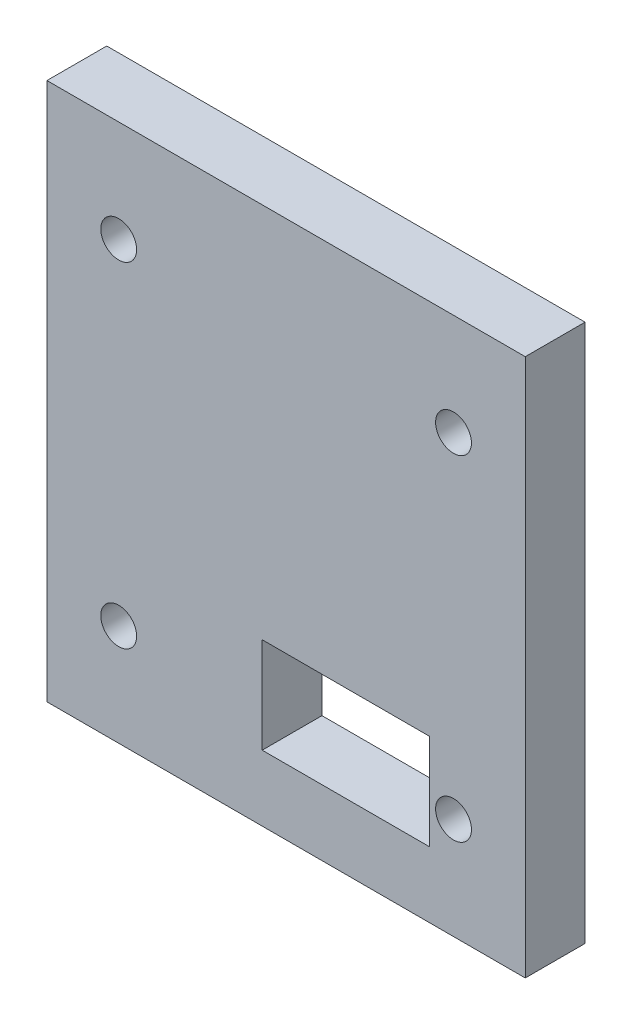
ISO-10303-21;
HEADER;
FILE_DESCRIPTION(('STEP AP214'),'2;1');
FILE_NAME('part.step','',(''),(''),'','','');
FILE_SCHEMA(('AUTOMOTIVE_DESIGN { 1 0 10303 214 1 1 1 1 }'));
ENDSEC;
DATA;
#1=APPLICATION_CONTEXT('core data for automotive mechanical design processes');
#2=APPLICATION_PROTOCOL_DEFINITION('international standard','automotive_design',2000,#1);
#3=PRODUCT_CONTEXT('',#1,'mechanical');
#4=PRODUCT('Part','Part','',(#3));
#5=PRODUCT_RELATED_PRODUCT_CATEGORY('part','',(#4));
#6=PRODUCT_DEFINITION_FORMATION('','',#4);
#7=PRODUCT_DEFINITION_CONTEXT('part definition',#1,'design');
#8=PRODUCT_DEFINITION('design','',#6,#7);
#9=PRODUCT_DEFINITION_SHAPE('','',#8);
#10=(LENGTH_UNIT() NAMED_UNIT(*) SI_UNIT(.MILLI.,.METRE.));
#11=(NAMED_UNIT(*) PLANE_ANGLE_UNIT() SI_UNIT($,.RADIAN.));
#12=(NAMED_UNIT(*) SI_UNIT($,.STERADIAN.) SOLID_ANGLE_UNIT());
#13=UNCERTAINTY_MEASURE_WITH_UNIT(LENGTH_MEASURE(1.E-05),#10,'distance_accuracy_value','');
#14=(GEOMETRIC_REPRESENTATION_CONTEXT(3) GLOBAL_UNCERTAINTY_ASSIGNED_CONTEXT((#13)) GLOBAL_UNIT_ASSIGNED_CONTEXT((#10,
#11,#12)) REPRESENTATION_CONTEXT('',''));
#15=CARTESIAN_POINT('',(0.,0.,0.));
#16=DIRECTION('',(0.,0.,1.));
#17=DIRECTION('',(1.,0.,0.));
#18=AXIS2_PLACEMENT_3D('',#15,#16,#17);
#19=CARTESIAN_POINT('',(0.,0.,5.));
#20=DIRECTION('',(0.,1.,0.));
#21=DIRECTION('',(0.,0.,1.));
#22=AXIS2_PLACEMENT_3D('',#19,#20,#21);
#23=PLANE('',#22);
#24=CARTESIAN_POINT('',(2.,0.,2.5));
#25=DIRECTION('',(0.,-1.,0.));
#26=DIRECTION('',(0.,0.,-1.));
#27=AXIS2_PLACEMENT_3D('',#24,#25,#26);
#28=CIRCLE('',#27,1.5);
#29=CARTESIAN_POINT('',(2.,0.,1.));
#30=VERTEX_POINT('',#29);
#31=EDGE_CURVE('E188',#30,#30,#28,.T.);
#32=ORIENTED_EDGE('',*,*,#31,.F.);
#33=EDGE_LOOP('',(#32));
#34=FACE_BOUND('',#33,.T.);
#35=CARTESIAN_POINT('',(25.25,0.,2.5));
#36=DIRECTION('',(0.,-1.,0.));
#37=DIRECTION('',(0.,0.,-1.));
#38=AXIS2_PLACEMENT_3D('',#35,#36,#37);
#39=CIRCLE('',#38,1.5);
#40=CARTESIAN_POINT('',(25.25,0.,0.999999999999999));
#41=VERTEX_POINT('',#40);
#42=EDGE_CURVE('E183',#41,#41,#39,.T.);
#43=ORIENTED_EDGE('',*,*,#42,.F.);
#44=EDGE_LOOP('',(#43));
#45=FACE_BOUND('',#44,.T.);
#46=CARTESIAN_POINT('',(9.75,0.,2.5));
#47=DIRECTION('',(0.,-1.,0.));
#48=DIRECTION('',(0.,0.,-1.));
#49=AXIS2_PLACEMENT_3D('',#46,#47,#48);
#50=CIRCLE('',#49,1.5);
#51=CARTESIAN_POINT('',(9.75,0.,0.999999999999998));
#52=VERTEX_POINT('',#51);
#53=EDGE_CURVE('E195',#52,#52,#50,.T.);
#54=ORIENTED_EDGE('',*,*,#53,.F.);
#55=EDGE_LOOP('',(#54));
#56=FACE_BOUND('',#55,.T.);
#57=CARTESIAN_POINT('',(33.,0.,2.5));
#58=DIRECTION('',(0.,-1.,0.));
#59=DIRECTION('',(0.,0.,-1.));
#60=AXIS2_PLACEMENT_3D('',#57,#58,#59);
#61=CIRCLE('',#60,1.5);
#62=CARTESIAN_POINT('',(33.,0.,0.999999999999996));
#63=VERTEX_POINT('',#62);
#64=EDGE_CURVE('E200',#63,#63,#61,.T.);
#65=ORIENTED_EDGE('',*,*,#64,.F.);
#66=EDGE_LOOP('',(#65));
#67=FACE_BOUND('',#66,.T.);
#68=DIRECTION('',(1.,0.,0.));
#69=VECTOR('',#68,1.);
#70=CARTESIAN_POINT('',(0.,0.,0.));
#71=LINE('',#70,#69);
#72=CARTESIAN_POINT('',(-2.5,0.,0.));
#73=VERTEX_POINT('',#72);
#74=CARTESIAN_POINT('',(37.5,0.,0.));
#75=VERTEX_POINT('',#74);
#76=EDGE_CURVE('E187',#73,#75,#71,.T.);
#77=ORIENTED_EDGE('',*,*,#76,.T.);
#78=DIRECTION('',(0.,0.,-1.));
#79=VECTOR('',#78,1.);
#80=CARTESIAN_POINT('',(37.5,0.,5.));
#81=LINE('',#80,#79);
#82=CARTESIAN_POINT('',(37.5,0.,5.));
#83=VERTEX_POINT('',#82);
#84=EDGE_CURVE('E174',#83,#75,#81,.T.);
#85=ORIENTED_EDGE('',*,*,#84,.F.);
#86=DIRECTION('',(1.,0.,0.));
#87=VECTOR('',#86,1.);
#88=CARTESIAN_POINT('',(0.,0.,5.));
#89=LINE('',#88,#87);
#90=CARTESIAN_POINT('',(-2.5,0.,5.));
#91=VERTEX_POINT('',#90);
#92=EDGE_CURVE('E41',#91,#83,#89,.T.);
#93=ORIENTED_EDGE('',*,*,#92,.F.);
#94=DIRECTION('',(0.,0.,1.));
#95=VECTOR('',#94,1.);
#96=CARTESIAN_POINT('',(-2.5,0.,0.));
#97=LINE('',#96,#95);
#98=EDGE_CURVE('E162',#73,#91,#97,.T.);
#99=ORIENTED_EDGE('',*,*,#98,.F.);
#100=EDGE_LOOP('',(#77,#85,#93,#99));
#101=FACE_BOUND('',#100,.T.);
#102=ADVANCED_FACE('F33',(#34,#45,#56,#67,#101),#23,.F.);
#103=CARTESIAN_POINT('',(0.,45.,5.));
#104=DIRECTION('',(0.,-1.,0.));
#105=DIRECTION('',(0.,0.,-1.));
#106=AXIS2_PLACEMENT_3D('',#103,#104,#105);
#107=PLANE('',#106);
#108=DIRECTION('',(-1.,0.,0.));
#109=VECTOR('',#108,1.);
#110=CARTESIAN_POINT('',(0.,45.,0.));
#111=LINE('',#110,#109);
#112=CARTESIAN_POINT('',(37.5,45.,0.));
#113=VERTEX_POINT('',#112);
#114=CARTESIAN_POINT('',(-2.5,45.,0.));
#115=VERTEX_POINT('',#114);
#116=EDGE_CURVE('E36',#113,#115,#111,.T.);
#117=ORIENTED_EDGE('',*,*,#116,.T.);
#118=DIRECTION('',(0.,0.,-1.));
#119=VECTOR('',#118,1.);
#120=CARTESIAN_POINT('',(-2.5,45.,0.));
#121=LINE('',#120,#119);
#122=CARTESIAN_POINT('',(-2.5,45.,4.99999999999999));
#123=VERTEX_POINT('',#122);
#124=EDGE_CURVE('E168',#123,#115,#121,.T.);
#125=ORIENTED_EDGE('',*,*,#124,.F.);
#126=DIRECTION('',(-1.,0.,0.));
#127=VECTOR('',#126,1.);
#128=CARTESIAN_POINT('',(0.,45.,5.));
#129=LINE('',#128,#127);
#130=CARTESIAN_POINT('',(37.5,45.,5.));
#131=VERTEX_POINT('',#130);
#132=EDGE_CURVE('E11',#131,#123,#129,.T.);
#133=ORIENTED_EDGE('',*,*,#132,.F.);
#134=DIRECTION('',(0.,0.,1.));
#135=VECTOR('',#134,1.);
#136=CARTESIAN_POINT('',(37.5,45.,5.));
#137=LINE('',#136,#135);
#138=EDGE_CURVE('E180',#113,#131,#137,.T.);
#139=ORIENTED_EDGE('',*,*,#138,.F.);
#140=EDGE_LOOP('',(#117,#125,#133,#139));
#141=FACE_BOUND('',#140,.T.);
#142=ADVANCED_FACE('F214',(#141),#107,.F.);
#143=CARTESIAN_POINT('',(0.,0.,5.));
#144=DIRECTION('',(0.,0.,-1.));
#145=DIRECTION('',(-1.,0.,0.));
#146=AXIS2_PLACEMENT_3D('',#143,#144,#145);
#147=PLANE('',#146);
#148=DIRECTION('',(0.,1.,0.));
#149=VECTOR('',#148,1.);
#150=CARTESIAN_POINT('',(29.5,13.5,5.));
#151=LINE('',#150,#149);
#152=CARTESIAN_POINT('',(29.5,5.5,5.));
#153=VERTEX_POINT('',#152);
#154=CARTESIAN_POINT('',(29.5,13.5,5.));
#155=VERTEX_POINT('',#154);
#156=EDGE_CURVE('E122',#153,#155,#151,.T.);
#157=ORIENTED_EDGE('',*,*,#156,.F.);
#158=DIRECTION('',(1.,0.,0.));
#159=VECTOR('',#158,1.);
#160=CARTESIAN_POINT('',(15.5,5.5,5.));
#161=LINE('',#160,#159);
#162=CARTESIAN_POINT('',(15.5,5.5,5.));
#163=VERTEX_POINT('',#162);
#164=EDGE_CURVE('E115',#163,#153,#161,.T.);
#165=ORIENTED_EDGE('',*,*,#164,.F.);
#166=DIRECTION('',(0.,-1.,0.));
#167=VECTOR('',#166,1.);
#168=CARTESIAN_POINT('',(15.5,13.5,5.));
#169=LINE('',#168,#167);
#170=CARTESIAN_POINT('',(15.5,13.5,5.));
#171=VERTEX_POINT('',#170);
#172=EDGE_CURVE('E126',#171,#163,#169,.T.);
#173=ORIENTED_EDGE('',*,*,#172,.F.);
#174=DIRECTION('',(-1.,0.,0.));
#175=VECTOR('',#174,1.);
#176=CARTESIAN_POINT('',(15.5,13.5,5.));
#177=LINE('',#176,#175);
#178=EDGE_CURVE('E49',#155,#171,#177,.T.);
#179=ORIENTED_EDGE('',*,*,#178,.F.);
#180=EDGE_LOOP('',(#157,#165,#173,#179));
#181=FACE_BOUND('',#180,.T.);
#182=CARTESIAN_POINT('',(3.5,8.5,5.));
#183=DIRECTION('',(0.,0.,1.));
#184=DIRECTION('',(1.,0.,0.));
#185=AXIS2_PLACEMENT_3D('',#182,#183,#184);
#186=CIRCLE('',#185,1.5);
#187=CARTESIAN_POINT('',(5.,8.5,5.));
#188=VERTEX_POINT('',#187);
#189=EDGE_CURVE('E135',#188,#188,#186,.T.);
#190=ORIENTED_EDGE('',*,*,#189,.F.);
#191=EDGE_LOOP('',(#190));
#192=FACE_BOUND('',#191,.T.);
#193=CARTESIAN_POINT('',(31.5,36.5,5.));
#194=DIRECTION('',(0.,0.,1.));
#195=DIRECTION('',(1.,0.,0.));
#196=AXIS2_PLACEMENT_3D('',#193,#194,#195);
#197=CIRCLE('',#196,1.50000000000001);
#198=CARTESIAN_POINT('',(33.,36.5,5.));
#199=VERTEX_POINT('',#198);
#200=EDGE_CURVE('E144',#199,#199,#197,.T.);
#201=ORIENTED_EDGE('',*,*,#200,.F.);
#202=EDGE_LOOP('',(#201));
#203=FACE_BOUND('',#202,.T.);
#204=CARTESIAN_POINT('',(31.5,8.5,5.));
#205=DIRECTION('',(0.,0.,1.));
#206=DIRECTION('',(1.,0.,0.));
#207=AXIS2_PLACEMENT_3D('',#204,#205,#206);
#208=CIRCLE('',#207,1.50000000000001);
#209=CARTESIAN_POINT('',(33.,8.5,5.));
#210=VERTEX_POINT('',#209);
#211=EDGE_CURVE('E136',#210,#210,#208,.T.);
#212=ORIENTED_EDGE('',*,*,#211,.F.);
#213=EDGE_LOOP('',(#212));
#214=FACE_BOUND('',#213,.T.);
#215=CARTESIAN_POINT('',(3.5,36.5,5.));
#216=DIRECTION('',(0.,0.,1.));
#217=DIRECTION('',(1.,0.,0.));
#218=AXIS2_PLACEMENT_3D('',#215,#216,#217);
#219=CIRCLE('',#218,1.5);
#220=CARTESIAN_POINT('',(5.,36.5,5.));
#221=VERTEX_POINT('',#220);
#222=EDGE_CURVE('E143',#221,#221,#219,.T.);
#223=ORIENTED_EDGE('',*,*,#222,.F.);
#224=EDGE_LOOP('',(#223));
#225=FACE_BOUND('',#224,.T.);
#226=ORIENTED_EDGE('',*,*,#132,.T.);
#227=DIRECTION('',(0.,1.,0.));
#228=VECTOR('',#227,1.);
#229=CARTESIAN_POINT('',(-2.5,45.,4.99999999999999));
#230=LINE('',#229,#228);
#231=EDGE_CURVE('E165',#91,#123,#230,.T.);
#232=ORIENTED_EDGE('',*,*,#231,.F.);
#233=ORIENTED_EDGE('',*,*,#92,.T.);
#234=DIRECTION('',(0.,-1.,0.));
#235=VECTOR('',#234,1.);
#236=CARTESIAN_POINT('',(37.5,45.,5.));
#237=LINE('',#236,#235);
#238=EDGE_CURVE('E171',#131,#83,#237,.T.);
#239=ORIENTED_EDGE('',*,*,#238,.F.);
#240=EDGE_LOOP('',(#226,#232,#233,#239));
#241=FACE_BOUND('',#240,.T.);
#242=ADVANCED_FACE('F222',(#181,#192,#203,#214,#225,#241),#147,.F.);
#243=CARTESIAN_POINT('',(0.,0.,0.));
#244=DIRECTION('',(0.,0.,-1.));
#245=DIRECTION('',(-1.,0.,0.));
#246=AXIS2_PLACEMENT_3D('',#243,#244,#245);
#247=PLANE('',#246);
#248=DIRECTION('',(1.,0.,0.));
#249=VECTOR('',#248,1.);
#250=CARTESIAN_POINT('',(15.5,5.5,0.));
#251=LINE('',#250,#249);
#252=CARTESIAN_POINT('',(15.5,5.5,0.));
#253=VERTEX_POINT('',#252);
#254=CARTESIAN_POINT('',(29.5,5.5,0.));
#255=VERTEX_POINT('',#254);
#256=EDGE_CURVE('E112',#253,#255,#251,.T.);
#257=ORIENTED_EDGE('',*,*,#256,.T.);
#258=DIRECTION('',(0.,1.,0.));
#259=VECTOR('',#258,1.);
#260=CARTESIAN_POINT('',(29.5,13.5,0.));
#261=LINE('',#260,#259);
#262=CARTESIAN_POINT('',(29.5,13.5,0.));
#263=VERTEX_POINT('',#262);
#264=EDGE_CURVE('E99',#255,#263,#261,.T.);
#265=ORIENTED_EDGE('',*,*,#264,.T.);
#266=DIRECTION('',(-1.,0.,0.));
#267=VECTOR('',#266,1.);
#268=CARTESIAN_POINT('',(15.5,13.5,0.));
#269=LINE('',#268,#267);
#270=CARTESIAN_POINT('',(15.5,13.5,0.));
#271=VERTEX_POINT('',#270);
#272=EDGE_CURVE('E130',#263,#271,#269,.T.);
#273=ORIENTED_EDGE('',*,*,#272,.T.);
#274=DIRECTION('',(0.,-1.,0.));
#275=VECTOR('',#274,1.);
#276=CARTESIAN_POINT('',(15.5,13.5,0.));
#277=LINE('',#276,#275);
#278=EDGE_CURVE('E120',#271,#253,#277,.T.);
#279=ORIENTED_EDGE('',*,*,#278,.T.);
#280=EDGE_LOOP('',(#257,#265,#273,#279));
#281=FACE_BOUND('',#280,.T.);
#282=CARTESIAN_POINT('',(3.5,8.5,0.));
#283=DIRECTION('',(0.,0.,-1.));
#284=DIRECTION('',(-1.,0.,0.));
#285=AXIS2_PLACEMENT_3D('',#282,#283,#284);
#286=CIRCLE('',#285,1.5);
#287=CARTESIAN_POINT('',(2.,8.5,0.));
#288=VERTEX_POINT('',#287);
#289=EDGE_CURVE('E147',#288,#288,#286,.F.);
#290=ORIENTED_EDGE('',*,*,#289,.T.);
#291=EDGE_LOOP('',(#290));
#292=FACE_BOUND('',#291,.T.);
#293=CARTESIAN_POINT('',(31.5,36.5,0.));
#294=DIRECTION('',(0.,0.,-1.));
#295=DIRECTION('',(-1.,0.,0.));
#296=AXIS2_PLACEMENT_3D('',#293,#294,#295);
#297=CIRCLE('',#296,1.50000000000001);
#298=CARTESIAN_POINT('',(30.,36.5,0.));
#299=VERTEX_POINT('',#298);
#300=EDGE_CURVE('E140',#299,#299,#297,.F.);
#301=ORIENTED_EDGE('',*,*,#300,.T.);
#302=EDGE_LOOP('',(#301));
#303=FACE_BOUND('',#302,.T.);
#304=CARTESIAN_POINT('',(31.5,8.5,0.));
#305=DIRECTION('',(0.,0.,-1.));
#306=DIRECTION('',(-1.,0.,0.));
#307=AXIS2_PLACEMENT_3D('',#304,#305,#306);
#308=CIRCLE('',#307,1.50000000000001);
#309=CARTESIAN_POINT('',(30.,8.5,0.));
#310=VERTEX_POINT('',#309);
#311=EDGE_CURVE('E139',#310,#310,#308,.F.);
#312=ORIENTED_EDGE('',*,*,#311,.T.);
#313=EDGE_LOOP('',(#312));
#314=FACE_BOUND('',#313,.T.);
#315=CARTESIAN_POINT('',(3.5,36.5,0.));
#316=DIRECTION('',(0.,0.,-1.));
#317=DIRECTION('',(-1.,0.,0.));
#318=AXIS2_PLACEMENT_3D('',#315,#316,#317);
#319=CIRCLE('',#318,1.5);
#320=CARTESIAN_POINT('',(2.,36.5,0.));
#321=VERTEX_POINT('',#320);
#322=EDGE_CURVE('E156',#321,#321,#319,.F.);
#323=ORIENTED_EDGE('',*,*,#322,.T.);
#324=EDGE_LOOP('',(#323));
#325=FACE_BOUND('',#324,.T.);
#326=ORIENTED_EDGE('',*,*,#76,.F.);
#327=DIRECTION('',(0.,-1.,0.));
#328=VECTOR('',#327,1.);
#329=CARTESIAN_POINT('',(-2.5,45.,0.));
#330=LINE('',#329,#328);
#331=EDGE_CURVE('E159',#115,#73,#330,.T.);
#332=ORIENTED_EDGE('',*,*,#331,.F.);
#333=ORIENTED_EDGE('',*,*,#116,.F.);
#334=DIRECTION('',(0.,1.,0.));
#335=VECTOR('',#334,1.);
#336=CARTESIAN_POINT('',(37.5,45.,0.));
#337=LINE('',#336,#335);
#338=EDGE_CURVE('E177',#75,#113,#337,.T.);
#339=ORIENTED_EDGE('',*,*,#338,.F.);
#340=EDGE_LOOP('',(#326,#332,#333,#339));
#341=FACE_BOUND('',#340,.T.);
#342=ADVANCED_FACE('F118',(#281,#292,#303,#314,#325,#341),#247,.T.);
#343=CARTESIAN_POINT('',(33.,5.,2.5));
#344=DIRECTION('',(0.,-1.,0.));
#345=DIRECTION('',(0.,0.,-1.));
#346=AXIS2_PLACEMENT_3D('',#343,#344,#345);
#347=CYLINDRICAL_SURFACE('',#346,1.5);
#348=CARTESIAN_POINT('',(33.,5.,2.5));
#349=DIRECTION('',(0.,-1.,0.));
#350=DIRECTION('',(0.,0.,-1.));
#351=AXIS2_PLACEMENT_3D('',#348,#349,#350);
#352=CIRCLE('',#351,1.5);
#353=CARTESIAN_POINT('',(33.,5.,0.999999999999996));
#354=VERTEX_POINT('',#353);
#355=EDGE_CURVE('E191',#354,#354,#352,.T.);
#356=ORIENTED_EDGE('',*,*,#355,.F.);
#357=EDGE_LOOP('',(#356));
#358=FACE_BOUND('',#357,.T.);
#359=ORIENTED_EDGE('',*,*,#64,.T.);
#360=EDGE_LOOP('',(#359));
#361=FACE_BOUND('',#360,.T.);
#362=ADVANCED_FACE('F251',(#358,#361),#347,.F.);
#363=CARTESIAN_POINT('',(33.,5.,2.5));
#364=DIRECTION('',(0.,-1.,0.));
#365=DIRECTION('',(0.,0.,-1.));
#366=AXIS2_PLACEMENT_3D('',#363,#364,#365);
#367=PLANE('',#366);
#368=ORIENTED_EDGE('',*,*,#355,.T.);
#369=EDGE_LOOP('',(#368));
#370=FACE_BOUND('',#369,.T.);
#371=ADVANCED_FACE('F253',(#370),#367,.T.);
#372=CARTESIAN_POINT('',(9.75,5.,2.5));
#373=DIRECTION('',(0.,-1.,0.));
#374=DIRECTION('',(0.,0.,-1.));
#375=AXIS2_PLACEMENT_3D('',#372,#373,#374);
#376=CYLINDRICAL_SURFACE('',#375,1.5);
#377=CARTESIAN_POINT('',(9.75,5.,2.5));
#378=DIRECTION('',(0.,-1.,0.));
#379=DIRECTION('',(0.,0.,-1.));
#380=AXIS2_PLACEMENT_3D('',#377,#378,#379);
#381=CIRCLE('',#380,1.5);
#382=CARTESIAN_POINT('',(9.75,5.,0.999999999999998));
#383=VERTEX_POINT('',#382);
#384=EDGE_CURVE('E203',#383,#383,#381,.T.);
#385=ORIENTED_EDGE('',*,*,#384,.F.);
#386=EDGE_LOOP('',(#385));
#387=FACE_BOUND('',#386,.T.);
#388=ORIENTED_EDGE('',*,*,#53,.T.);
#389=EDGE_LOOP('',(#388));
#390=FACE_BOUND('',#389,.T.);
#391=ADVANCED_FACE('F260',(#387,#390),#376,.F.);
#392=CARTESIAN_POINT('',(9.75,5.,2.5));
#393=DIRECTION('',(0.,-1.,0.));
#394=DIRECTION('',(0.,0.,-1.));
#395=AXIS2_PLACEMENT_3D('',#392,#393,#394);
#396=PLANE('',#395);
#397=ORIENTED_EDGE('',*,*,#384,.T.);
#398=EDGE_LOOP('',(#397));
#399=FACE_BOUND('',#398,.T.);
#400=ADVANCED_FACE('F268',(#399),#396,.T.);
#401=CARTESIAN_POINT('',(25.25,5.,2.5));
#402=DIRECTION('',(0.,-1.,0.));
#403=DIRECTION('',(0.,0.,-1.));
#404=AXIS2_PLACEMENT_3D('',#401,#402,#403);
#405=CYLINDRICAL_SURFACE('',#404,1.5);
#406=CARTESIAN_POINT('',(25.25,5.,2.5));
#407=DIRECTION('',(0.,-1.,0.));
#408=DIRECTION('',(0.,0.,-1.));
#409=AXIS2_PLACEMENT_3D('',#406,#407,#408);
#410=CIRCLE('',#409,1.5);
#411=CARTESIAN_POINT('',(25.25,5.,0.999999999999999));
#412=VERTEX_POINT('',#411);
#413=EDGE_CURVE('E192',#412,#412,#410,.T.);
#414=ORIENTED_EDGE('',*,*,#413,.F.);
#415=EDGE_LOOP('',(#414));
#416=FACE_BOUND('',#415,.T.);
#417=ORIENTED_EDGE('',*,*,#42,.T.);
#418=EDGE_LOOP('',(#417));
#419=FACE_BOUND('',#418,.T.);
#420=ADVANCED_FACE('F271',(#416,#419),#405,.F.);
#421=CARTESIAN_POINT('',(25.25,5.,2.5));
#422=DIRECTION('',(0.,-1.,0.));
#423=DIRECTION('',(0.,0.,-1.));
#424=AXIS2_PLACEMENT_3D('',#421,#422,#423);
#425=PLANE('',#424);
#426=ORIENTED_EDGE('',*,*,#413,.T.);
#427=EDGE_LOOP('',(#426));
#428=FACE_BOUND('',#427,.T.);
#429=ADVANCED_FACE('F390',(#428),#425,.T.);
#430=CARTESIAN_POINT('',(2.,5.,2.5));
#431=DIRECTION('',(0.,-1.,0.));
#432=DIRECTION('',(0.,0.,-1.));
#433=AXIS2_PLACEMENT_3D('',#430,#431,#432);
#434=CYLINDRICAL_SURFACE('',#433,1.5);
#435=CARTESIAN_POINT('',(2.,5.,2.5));
#436=DIRECTION('',(0.,-1.,0.));
#437=DIRECTION('',(0.,0.,-1.));
#438=AXIS2_PLACEMENT_3D('',#435,#436,#437);
#439=CIRCLE('',#438,1.5);
#440=CARTESIAN_POINT('',(2.,5.,1.));
#441=VERTEX_POINT('',#440);
#442=EDGE_CURVE('E184',#441,#441,#439,.T.);
#443=ORIENTED_EDGE('',*,*,#442,.F.);
#444=EDGE_LOOP('',(#443));
#445=FACE_BOUND('',#444,.T.);
#446=ORIENTED_EDGE('',*,*,#31,.T.);
#447=EDGE_LOOP('',(#446));
#448=FACE_BOUND('',#447,.T.);
#449=ADVANCED_FACE('F235',(#445,#448),#434,.F.);
#450=CARTESIAN_POINT('',(2.,5.,2.5));
#451=DIRECTION('',(0.,-1.,0.));
#452=DIRECTION('',(0.,0.,-1.));
#453=AXIS2_PLACEMENT_3D('',#450,#451,#452);
#454=PLANE('',#453);
#455=ORIENTED_EDGE('',*,*,#442,.T.);
#456=EDGE_LOOP('',(#455));
#457=FACE_BOUND('',#456,.T.);
#458=ADVANCED_FACE('F227',(#457),#454,.T.);
#459=CARTESIAN_POINT('',(37.5,0.,0.));
#460=DIRECTION('',(1.,0.,0.));
#461=DIRECTION('',(0.,0.,-1.));
#462=AXIS2_PLACEMENT_3D('',#459,#460,#461);
#463=PLANE('',#462);
#464=ORIENTED_EDGE('',*,*,#238,.T.);
#465=ORIENTED_EDGE('',*,*,#84,.T.);
#466=ORIENTED_EDGE('',*,*,#338,.T.);
#467=ORIENTED_EDGE('',*,*,#138,.T.);
#468=EDGE_LOOP('',(#464,#465,#466,#467));
#469=FACE_BOUND('',#468,.T.);
#470=ADVANCED_FACE('F225',(#469),#463,.T.);
#471=CARTESIAN_POINT('',(-2.5,0.,0.));
#472=DIRECTION('',(-1.,0.,0.));
#473=DIRECTION('',(0.,0.,1.));
#474=AXIS2_PLACEMENT_3D('',#471,#472,#473);
#475=PLANE('',#474);
#476=ORIENTED_EDGE('',*,*,#331,.T.);
#477=ORIENTED_EDGE('',*,*,#98,.T.);
#478=ORIENTED_EDGE('',*,*,#231,.T.);
#479=ORIENTED_EDGE('',*,*,#124,.T.);
#480=EDGE_LOOP('',(#476,#477,#478,#479));
#481=FACE_BOUND('',#480,.T.);
#482=ADVANCED_FACE('F219',(#481),#475,.T.);
#483=CARTESIAN_POINT('',(3.5,36.5,-4.24264068711932));
#484=DIRECTION('',(0.,0.,1.));
#485=DIRECTION('',(1.,0.,0.));
#486=AXIS2_PLACEMENT_3D('',#483,#484,#485);
#487=CYLINDRICAL_SURFACE('',#486,1.5);
#488=ORIENTED_EDGE('',*,*,#222,.T.);
#489=EDGE_LOOP('',(#488));
#490=FACE_BOUND('',#489,.T.);
#491=ORIENTED_EDGE('',*,*,#322,.F.);
#492=EDGE_LOOP('',(#491));
#493=FACE_BOUND('',#492,.T.);
#494=ADVANCED_FACE('F233',(#490,#493),#487,.F.);
#495=CARTESIAN_POINT('',(31.5,8.5,-4.24264068711932));
#496=DIRECTION('',(0.,0.,1.));
#497=DIRECTION('',(1.,0.,0.));
#498=AXIS2_PLACEMENT_3D('',#495,#496,#497);
#499=CYLINDRICAL_SURFACE('',#498,1.50000000000001);
#500=ORIENTED_EDGE('',*,*,#211,.T.);
#501=EDGE_LOOP('',(#500));
#502=FACE_BOUND('',#501,.T.);
#503=ORIENTED_EDGE('',*,*,#311,.F.);
#504=EDGE_LOOP('',(#503));
#505=FACE_BOUND('',#504,.T.);
#506=ADVANCED_FACE('F292',(#502,#505),#499,.F.);
#507=CARTESIAN_POINT('',(31.5,36.5,-4.24264068711932));
#508=DIRECTION('',(0.,0.,1.));
#509=DIRECTION('',(1.,0.,0.));
#510=AXIS2_PLACEMENT_3D('',#507,#508,#509);
#511=CYLINDRICAL_SURFACE('',#510,1.50000000000001);
#512=ORIENTED_EDGE('',*,*,#200,.T.);
#513=EDGE_LOOP('',(#512));
#514=FACE_BOUND('',#513,.T.);
#515=ORIENTED_EDGE('',*,*,#300,.F.);
#516=EDGE_LOOP('',(#515));
#517=FACE_BOUND('',#516,.T.);
#518=ADVANCED_FACE('F299',(#514,#517),#511,.F.);
#519=CARTESIAN_POINT('',(3.5,8.5,-4.24264068711932));
#520=DIRECTION('',(0.,0.,1.));
#521=DIRECTION('',(1.,0.,0.));
#522=AXIS2_PLACEMENT_3D('',#519,#520,#521);
#523=CYLINDRICAL_SURFACE('',#522,1.5);
#524=ORIENTED_EDGE('',*,*,#189,.T.);
#525=EDGE_LOOP('',(#524));
#526=FACE_BOUND('',#525,.T.);
#527=ORIENTED_EDGE('',*,*,#289,.F.);
#528=EDGE_LOOP('',(#527));
#529=FACE_BOUND('',#528,.T.);
#530=ADVANCED_FACE('F303',(#526,#529),#523,.F.);
#531=CARTESIAN_POINT('',(15.5,5.5,-16.1245154965971));
#532=DIRECTION('',(0.,-1.,0.));
#533=DIRECTION('',(0.,0.,-1.));
#534=AXIS2_PLACEMENT_3D('',#531,#532,#533);
#535=PLANE('',#534);
#536=DIRECTION('',(0.,0.,1.));
#537=VECTOR('',#536,1.);
#538=CARTESIAN_POINT('',(15.5,5.5,-16.1245154965971));
#539=LINE('',#538,#537);
#540=EDGE_CURVE('E57',#253,#163,#539,.T.);
#541=ORIENTED_EDGE('',*,*,#540,.T.);
#542=ORIENTED_EDGE('',*,*,#164,.T.);
#543=DIRECTION('',(0.,0.,1.));
#544=VECTOR('',#543,1.);
#545=CARTESIAN_POINT('',(29.5,5.5,-16.1245154965971));
#546=LINE('',#545,#544);
#547=EDGE_CURVE('E103',#255,#153,#546,.T.);
#548=ORIENTED_EDGE('',*,*,#547,.F.);
#549=ORIENTED_EDGE('',*,*,#256,.F.);
#550=EDGE_LOOP('',(#541,#542,#548,#549));
#551=FACE_BOUND('',#550,.T.);
#552=ADVANCED_FACE('F111',(#551),#535,.F.);
#553=CARTESIAN_POINT('',(29.5,13.5,-16.1245154965971));
#554=DIRECTION('',(1.,0.,0.));
#555=DIRECTION('',(0.,0.,-1.));
#556=AXIS2_PLACEMENT_3D('',#553,#554,#555);
#557=PLANE('',#556);
#558=ORIENTED_EDGE('',*,*,#547,.T.);
#559=ORIENTED_EDGE('',*,*,#156,.T.);
#560=DIRECTION('',(0.,0.,1.));
#561=VECTOR('',#560,1.);
#562=CARTESIAN_POINT('',(29.5,13.5,-16.1245154965971));
#563=LINE('',#562,#561);
#564=EDGE_CURVE('E105',#263,#155,#563,.T.);
#565=ORIENTED_EDGE('',*,*,#564,.F.);
#566=ORIENTED_EDGE('',*,*,#264,.F.);
#567=EDGE_LOOP('',(#558,#559,#565,#566));
#568=FACE_BOUND('',#567,.T.);
#569=ADVANCED_FACE('F101',(#568),#557,.F.);
#570=CARTESIAN_POINT('',(15.5,13.5,-16.1245154965971));
#571=DIRECTION('',(0.,1.,0.));
#572=DIRECTION('',(0.,0.,1.));
#573=AXIS2_PLACEMENT_3D('',#570,#571,#572);
#574=PLANE('',#573);
#575=ORIENTED_EDGE('',*,*,#564,.T.);
#576=ORIENTED_EDGE('',*,*,#178,.T.);
#577=DIRECTION('',(0.,0.,1.));
#578=VECTOR('',#577,1.);
#579=CARTESIAN_POINT('',(15.5,13.5,-16.1245154965971));
#580=LINE('',#579,#578);
#581=EDGE_CURVE('E129',#271,#171,#580,.T.);
#582=ORIENTED_EDGE('',*,*,#581,.F.);
#583=ORIENTED_EDGE('',*,*,#272,.F.);
#584=EDGE_LOOP('',(#575,#576,#582,#583));
#585=FACE_BOUND('',#584,.T.);
#586=ADVANCED_FACE('F314',(#585),#574,.F.);
#587=CARTESIAN_POINT('',(15.5,13.5,-16.1245154965971));
#588=DIRECTION('',(-1.,0.,0.));
#589=DIRECTION('',(0.,-1.,0.));
#590=AXIS2_PLACEMENT_3D('',#587,#588,#589);
#591=PLANE('',#590);
#592=ORIENTED_EDGE('',*,*,#581,.T.);
#593=ORIENTED_EDGE('',*,*,#172,.T.);
#594=ORIENTED_EDGE('',*,*,#540,.F.);
#595=ORIENTED_EDGE('',*,*,#278,.F.);
#596=EDGE_LOOP('',(#592,#593,#594,#595));
#597=FACE_BOUND('',#596,.T.);
#598=ADVANCED_FACE('F317',(#597),#591,.F.);
#599=CLOSED_SHELL('',(#102,#142,#242,#342,#362,#371,#391,#400,#420,#429,#449,#458,#470,#482,
#494,#506,#518,#530,#552,#569,#586,#598));
#600=MANIFOLD_SOLID_BREP('B2',#599);
#601=ADVANCED_BREP_SHAPE_REPRESENTATION('',(#18,#600),#14);
#602=SHAPE_DEFINITION_REPRESENTATION(#9,#601);
ENDSEC;
END-ISO-10303-21;
